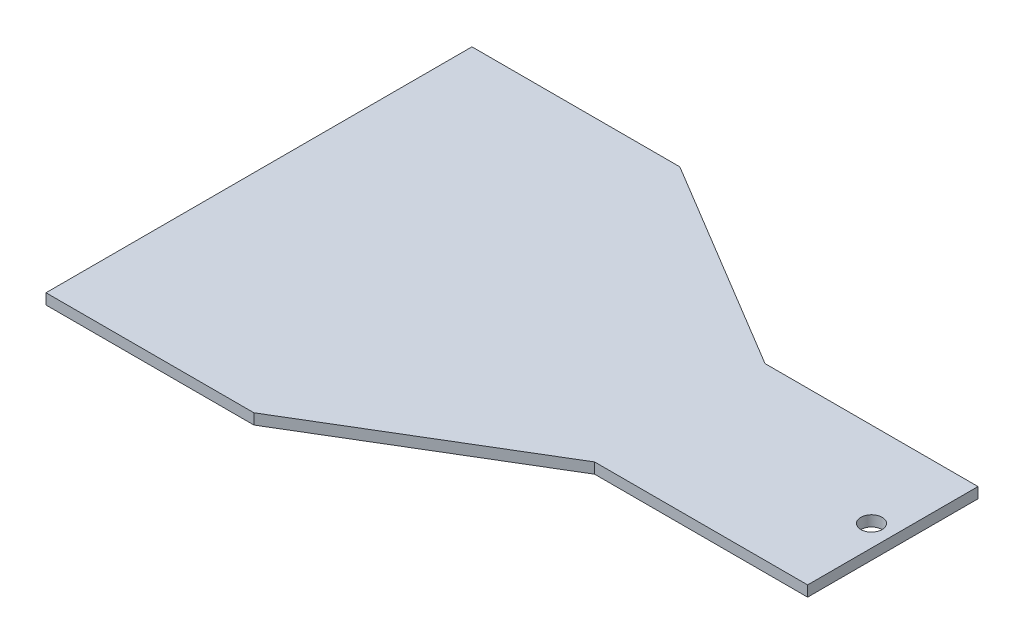
ISO-10303-21;
HEADER;
FILE_DESCRIPTION(('STEP AP214'),'2;1');
FILE_NAME('part.step','',(''),(''),'','','');
FILE_SCHEMA(('AUTOMOTIVE_DESIGN { 1 0 10303 214 1 1 1 1 }'));
ENDSEC;
DATA;
#1=APPLICATION_CONTEXT('core data for automotive mechanical design processes');
#2=APPLICATION_PROTOCOL_DEFINITION('international standard','automotive_design',2000,#1);
#3=PRODUCT_CONTEXT('',#1,'mechanical');
#4=PRODUCT('Part','Part','',(#3));
#5=PRODUCT_RELATED_PRODUCT_CATEGORY('part','',(#4));
#6=PRODUCT_DEFINITION_FORMATION('','',#4);
#7=PRODUCT_DEFINITION_CONTEXT('part definition',#1,'design');
#8=PRODUCT_DEFINITION('design','',#6,#7);
#9=PRODUCT_DEFINITION_SHAPE('','',#8);
#10=(LENGTH_UNIT() NAMED_UNIT(*) SI_UNIT(.MILLI.,.METRE.));
#11=(NAMED_UNIT(*) PLANE_ANGLE_UNIT() SI_UNIT($,.RADIAN.));
#12=(NAMED_UNIT(*) SI_UNIT($,.STERADIAN.) SOLID_ANGLE_UNIT());
#13=UNCERTAINTY_MEASURE_WITH_UNIT(LENGTH_MEASURE(1.E-05),#10,'distance_accuracy_value','');
#14=(GEOMETRIC_REPRESENTATION_CONTEXT(3) GLOBAL_UNCERTAINTY_ASSIGNED_CONTEXT((#13)) GLOBAL_UNIT_ASSIGNED_CONTEXT((#10,
#11,#12)) REPRESENTATION_CONTEXT('',''));
#15=CARTESIAN_POINT('',(0.,0.,0.));
#16=DIRECTION('',(0.,0.,1.));
#17=DIRECTION('',(1.,0.,0.));
#18=AXIS2_PLACEMENT_3D('',#15,#16,#17);
#19=CARTESIAN_POINT('',(0.,3.175,0.));
#20=DIRECTION('',(0.,-1.,0.));
#21=DIRECTION('',(0.,0.,-1.));
#22=AXIS2_PLACEMENT_3D('',#19,#20,#21);
#23=PLANE('',#22);
#24=DIRECTION('',(0.,0.,1.));
#25=VECTOR('',#24,1.);
#26=CARTESIAN_POINT('',(0.,3.175,0.));
#27=LINE('',#26,#25);
#28=CARTESIAN_POINT('',(0.,3.175,-127.));
#29=VERTEX_POINT('',#28);
#30=CARTESIAN_POINT('',(0.,3.175,0.));
#31=VERTEX_POINT('',#30);
#32=EDGE_CURVE('E144',#29,#31,#27,.T.);
#33=ORIENTED_EDGE('',*,*,#32,.T.);
#34=DIRECTION('',(1.,0.,0.));
#35=VECTOR('',#34,1.);
#36=CARTESIAN_POINT('',(0.,3.175,0.));
#37=LINE('',#36,#35);
#38=CARTESIAN_POINT('',(61.976,3.175,0.));
#39=VERTEX_POINT('',#38);
#40=EDGE_CURVE('E92',#31,#39,#37,.T.);
#41=ORIENTED_EDGE('',*,*,#40,.T.);
#42=DIRECTION('',(0.857492925712544,0.,-0.514495755427527));
#43=VECTOR('',#42,1.);
#44=CARTESIAN_POINT('',(61.976,3.175,0.));
#45=LINE('',#44,#43);
#46=CARTESIAN_POINT('',(125.476,3.175,-38.1));
#47=VERTEX_POINT('',#46);
#48=EDGE_CURVE('E159',#39,#47,#45,.T.);
#49=ORIENTED_EDGE('',*,*,#48,.T.);
#50=DIRECTION('',(1.,0.,0.));
#51=VECTOR('',#50,1.);
#52=CARTESIAN_POINT('',(125.476,3.175,-38.1));
#53=LINE('',#52,#51);
#54=CARTESIAN_POINT('',(188.976,3.175,-38.1));
#55=VERTEX_POINT('',#54);
#56=EDGE_CURVE('E172',#47,#55,#53,.T.);
#57=ORIENTED_EDGE('',*,*,#56,.T.);
#58=DIRECTION('',(0.,0.,-1.));
#59=VECTOR('',#58,1.);
#60=CARTESIAN_POINT('',(188.976,3.175,-38.1));
#61=LINE('',#60,#59);
#62=CARTESIAN_POINT('',(188.976,3.175,-88.9));
#63=VERTEX_POINT('',#62);
#64=EDGE_CURVE('E111',#55,#63,#61,.T.);
#65=ORIENTED_EDGE('',*,*,#64,.T.);
#66=DIRECTION('',(-1.,0.,0.));
#67=VECTOR('',#66,1.);
#68=CARTESIAN_POINT('',(125.476,3.175,-88.9));
#69=LINE('',#68,#67);
#70=CARTESIAN_POINT('',(125.476,3.175,-88.9));
#71=VERTEX_POINT('',#70);
#72=EDGE_CURVE('E105',#63,#71,#69,.T.);
#73=ORIENTED_EDGE('',*,*,#72,.T.);
#74=DIRECTION('',(-0.857492925712544,0.,-0.514495755427526));
#75=VECTOR('',#74,1.);
#76=CARTESIAN_POINT('',(125.476,3.175,-88.9));
#77=LINE('',#76,#75);
#78=CARTESIAN_POINT('',(61.976,3.175,-127.));
#79=VERTEX_POINT('',#78);
#80=EDGE_CURVE('E109',#71,#79,#77,.T.);
#81=ORIENTED_EDGE('',*,*,#80,.T.);
#82=DIRECTION('',(-1.,0.,0.));
#83=VECTOR('',#82,1.);
#84=CARTESIAN_POINT('',(0.,3.175,-127.));
#85=LINE('',#84,#83);
#86=EDGE_CURVE('E49',#79,#29,#85,.T.);
#87=ORIENTED_EDGE('',*,*,#86,.T.);
#88=EDGE_LOOP('',(#33,#41,#49,#57,#65,#73,#81,#87));
#89=FACE_BOUND('',#88,.T.);
#90=CARTESIAN_POINT('',(182.626,3.175,-63.5));
#91=DIRECTION('',(0.,1.,0.));
#92=DIRECTION('',(0.,0.,1.));
#93=AXIS2_PLACEMENT_3D('',#90,#91,#92);
#94=CIRCLE('',#93,3.175);
#95=CARTESIAN_POINT('',(182.626,3.175,-60.325));
#96=VERTEX_POINT('',#95);
#97=EDGE_CURVE('E133',#96,#96,#94,.T.);
#98=ORIENTED_EDGE('',*,*,#97,.F.);
#99=EDGE_LOOP('',(#98));
#100=FACE_BOUND('',#99,.T.);
#101=ADVANCED_FACE('F32',(#89,#100),#23,.F.);
#102=CARTESIAN_POINT('',(0.,0.,0.));
#103=DIRECTION('',(0.,-1.,0.));
#104=DIRECTION('',(0.,0.,-1.));
#105=AXIS2_PLACEMENT_3D('',#102,#103,#104);
#106=PLANE('',#105);
#107=DIRECTION('',(0.,0.,1.));
#108=VECTOR('',#107,1.);
#109=CARTESIAN_POINT('',(0.,0.,0.));
#110=LINE('',#109,#108);
#111=CARTESIAN_POINT('',(0.,0.,-127.));
#112=VERTEX_POINT('',#111);
#113=CARTESIAN_POINT('',(0.,0.,0.));
#114=VERTEX_POINT('',#113);
#115=EDGE_CURVE('E129',#112,#114,#110,.T.);
#116=ORIENTED_EDGE('',*,*,#115,.F.);
#117=DIRECTION('',(-1.,0.,0.));
#118=VECTOR('',#117,1.);
#119=CARTESIAN_POINT('',(0.,0.,-127.));
#120=LINE('',#119,#118);
#121=CARTESIAN_POINT('',(61.976,0.,-127.));
#122=VERTEX_POINT('',#121);
#123=EDGE_CURVE('E84',#122,#112,#120,.T.);
#124=ORIENTED_EDGE('',*,*,#123,.F.);
#125=DIRECTION('',(-0.857492925712544,0.,-0.514495755427526));
#126=VECTOR('',#125,1.);
#127=CARTESIAN_POINT('',(125.476,0.,-88.9));
#128=LINE('',#127,#126);
#129=CARTESIAN_POINT('',(125.476,0.,-88.9));
#130=VERTEX_POINT('',#129);
#131=EDGE_CURVE('E78',#130,#122,#128,.T.);
#132=ORIENTED_EDGE('',*,*,#131,.F.);
#133=DIRECTION('',(-1.,0.,0.));
#134=VECTOR('',#133,1.);
#135=CARTESIAN_POINT('',(125.476,0.,-88.9));
#136=LINE('',#135,#134);
#137=CARTESIAN_POINT('',(188.976,0.,-88.9));
#138=VERTEX_POINT('',#137);
#139=EDGE_CURVE('E119',#138,#130,#136,.T.);
#140=ORIENTED_EDGE('',*,*,#139,.F.);
#141=DIRECTION('',(0.,0.,-1.));
#142=VECTOR('',#141,1.);
#143=CARTESIAN_POINT('',(188.976,0.,-38.1));
#144=LINE('',#143,#142);
#145=CARTESIAN_POINT('',(188.976,0.,-38.1));
#146=VERTEX_POINT('',#145);
#147=EDGE_CURVE('E139',#146,#138,#144,.T.);
#148=ORIENTED_EDGE('',*,*,#147,.F.);
#149=DIRECTION('',(1.,0.,0.));
#150=VECTOR('',#149,1.);
#151=CARTESIAN_POINT('',(125.476,0.,-38.1));
#152=LINE('',#151,#150);
#153=CARTESIAN_POINT('',(125.476,0.,-38.1));
#154=VERTEX_POINT('',#153);
#155=EDGE_CURVE('E137',#154,#146,#152,.T.);
#156=ORIENTED_EDGE('',*,*,#155,.F.);
#157=DIRECTION('',(0.857492925712544,0.,-0.514495755427527));
#158=VECTOR('',#157,1.);
#159=CARTESIAN_POINT('',(61.976,0.,0.));
#160=LINE('',#159,#158);
#161=CARTESIAN_POINT('',(61.976,0.,0.));
#162=VERTEX_POINT('',#161);
#163=EDGE_CURVE('E135',#162,#154,#160,.T.);
#164=ORIENTED_EDGE('',*,*,#163,.F.);
#165=DIRECTION('',(1.,0.,0.));
#166=VECTOR('',#165,1.);
#167=CARTESIAN_POINT('',(0.,0.,0.));
#168=LINE('',#167,#166);
#169=EDGE_CURVE('E132',#114,#162,#168,.T.);
#170=ORIENTED_EDGE('',*,*,#169,.F.);
#171=EDGE_LOOP('',(#116,#124,#132,#140,#148,#156,#164,#170));
#172=FACE_BOUND('',#171,.T.);
#173=CARTESIAN_POINT('',(182.626,0.,-63.5));
#174=DIRECTION('',(0.,1.,0.));
#175=DIRECTION('',(0.,0.,1.));
#176=AXIS2_PLACEMENT_3D('',#173,#174,#175);
#177=CIRCLE('',#176,3.175);
#178=CARTESIAN_POINT('',(182.626,0.,-60.325));
#179=VERTEX_POINT('',#178);
#180=EDGE_CURVE('E178',#179,#179,#177,.T.);
#181=ORIENTED_EDGE('',*,*,#180,.T.);
#182=EDGE_LOOP('',(#181));
#183=FACE_BOUND('',#182,.T.);
#184=ADVANCED_FACE('F163',(#172,#183),#106,.T.);
#185=CARTESIAN_POINT('',(0.,3.175,0.));
#186=DIRECTION('',(1.,0.,0.));
#187=DIRECTION('',(0.,0.,-1.));
#188=AXIS2_PLACEMENT_3D('',#185,#186,#187);
#189=PLANE('',#188);
#190=ORIENTED_EDGE('',*,*,#115,.T.);
#191=DIRECTION('',(0.,-1.,0.));
#192=VECTOR('',#191,1.);
#193=CARTESIAN_POINT('',(0.,3.175,0.));
#194=LINE('',#193,#192);
#195=EDGE_CURVE('E11',#31,#114,#194,.T.);
#196=ORIENTED_EDGE('',*,*,#195,.F.);
#197=ORIENTED_EDGE('',*,*,#32,.F.);
#198=DIRECTION('',(0.,-1.,0.));
#199=VECTOR('',#198,1.);
#200=CARTESIAN_POINT('',(0.,3.175,-127.));
#201=LINE('',#200,#199);
#202=EDGE_CURVE('E125',#29,#112,#201,.T.);
#203=ORIENTED_EDGE('',*,*,#202,.T.);
#204=EDGE_LOOP('',(#190,#196,#197,#203));
#205=FACE_BOUND('',#204,.T.);
#206=ADVANCED_FACE('F34',(#205),#189,.F.);
#207=CARTESIAN_POINT('',(0.,3.175,0.));
#208=DIRECTION('',(0.,0.,-1.));
#209=DIRECTION('',(-1.,0.,0.));
#210=AXIS2_PLACEMENT_3D('',#207,#208,#209);
#211=PLANE('',#210);
#212=ORIENTED_EDGE('',*,*,#169,.T.);
#213=DIRECTION('',(0.,-1.,0.));
#214=VECTOR('',#213,1.);
#215=CARTESIAN_POINT('',(61.976,3.175,0.));
#216=LINE('',#215,#214);
#217=EDGE_CURVE('E41',#39,#162,#216,.T.);
#218=ORIENTED_EDGE('',*,*,#217,.F.);
#219=ORIENTED_EDGE('',*,*,#40,.F.);
#220=ORIENTED_EDGE('',*,*,#195,.T.);
#221=EDGE_LOOP('',(#212,#218,#219,#220));
#222=FACE_BOUND('',#221,.T.);
#223=ADVANCED_FACE('F206',(#222),#211,.F.);
#224=CARTESIAN_POINT('',(61.976,3.175,0.));
#225=DIRECTION('',(-0.514495755427527,0.,-0.857492925712544));
#226=DIRECTION('',(-0.857492925712544,0.,0.514495755427527));
#227=AXIS2_PLACEMENT_3D('',#224,#225,#226);
#228=PLANE('',#227);
#229=ORIENTED_EDGE('',*,*,#163,.T.);
#230=DIRECTION('',(0.,-1.,0.));
#231=VECTOR('',#230,1.);
#232=CARTESIAN_POINT('',(125.476,3.175,-38.1));
#233=LINE('',#232,#231);
#234=EDGE_CURVE('E151',#47,#154,#233,.T.);
#235=ORIENTED_EDGE('',*,*,#234,.F.);
#236=ORIENTED_EDGE('',*,*,#48,.F.);
#237=ORIENTED_EDGE('',*,*,#217,.T.);
#238=EDGE_LOOP('',(#229,#235,#236,#237));
#239=FACE_BOUND('',#238,.T.);
#240=ADVANCED_FACE('F157',(#239),#228,.F.);
#241=CARTESIAN_POINT('',(125.476,3.175,-38.1));
#242=DIRECTION('',(0.,0.,-1.));
#243=DIRECTION('',(-1.,0.,0.));
#244=AXIS2_PLACEMENT_3D('',#241,#242,#243);
#245=PLANE('',#244);
#246=ORIENTED_EDGE('',*,*,#155,.T.);
#247=DIRECTION('',(0.,-1.,0.));
#248=VECTOR('',#247,1.);
#249=CARTESIAN_POINT('',(188.976,3.175,-38.1));
#250=LINE('',#249,#248);
#251=EDGE_CURVE('E148',#55,#146,#250,.T.);
#252=ORIENTED_EDGE('',*,*,#251,.F.);
#253=ORIENTED_EDGE('',*,*,#56,.F.);
#254=ORIENTED_EDGE('',*,*,#234,.T.);
#255=EDGE_LOOP('',(#246,#252,#253,#254));
#256=FACE_BOUND('',#255,.T.);
#257=ADVANCED_FACE('F168',(#256),#245,.F.);
#258=CARTESIAN_POINT('',(188.976,3.175,-38.1));
#259=DIRECTION('',(-1.,0.,0.));
#260=DIRECTION('',(0.,0.,1.));
#261=AXIS2_PLACEMENT_3D('',#258,#259,#260);
#262=PLANE('',#261);
#263=ORIENTED_EDGE('',*,*,#147,.T.);
#264=DIRECTION('',(0.,-1.,0.));
#265=VECTOR('',#264,1.);
#266=CARTESIAN_POINT('',(188.976,3.175,-88.9));
#267=LINE('',#266,#265);
#268=EDGE_CURVE('E120',#63,#138,#267,.T.);
#269=ORIENTED_EDGE('',*,*,#268,.F.);
#270=ORIENTED_EDGE('',*,*,#64,.F.);
#271=ORIENTED_EDGE('',*,*,#251,.T.);
#272=EDGE_LOOP('',(#263,#269,#270,#271));
#273=FACE_BOUND('',#272,.T.);
#274=ADVANCED_FACE('F171',(#273),#262,.F.);
#275=CARTESIAN_POINT('',(125.476,3.175,-88.9));
#276=DIRECTION('',(0.,0.,1.));
#277=DIRECTION('',(1.,0.,0.));
#278=AXIS2_PLACEMENT_3D('',#275,#276,#277);
#279=PLANE('',#278);
#280=ORIENTED_EDGE('',*,*,#139,.T.);
#281=DIRECTION('',(0.,-1.,0.));
#282=VECTOR('',#281,1.);
#283=CARTESIAN_POINT('',(125.476,3.175,-88.9));
#284=LINE('',#283,#282);
#285=EDGE_CURVE('E116',#71,#130,#284,.T.);
#286=ORIENTED_EDGE('',*,*,#285,.F.);
#287=ORIENTED_EDGE('',*,*,#72,.F.);
#288=ORIENTED_EDGE('',*,*,#268,.T.);
#289=EDGE_LOOP('',(#280,#286,#287,#288));
#290=FACE_BOUND('',#289,.T.);
#291=ADVANCED_FACE('F117',(#290),#279,.F.);
#292=CARTESIAN_POINT('',(125.476,3.175,-88.9));
#293=DIRECTION('',(-0.514495755427526,0.,0.857492925712544));
#294=DIRECTION('',(0.857492925712544,0.,0.514495755427526));
#295=AXIS2_PLACEMENT_3D('',#292,#293,#294);
#296=PLANE('',#295);
#297=ORIENTED_EDGE('',*,*,#131,.T.);
#298=DIRECTION('',(0.,-1.,0.));
#299=VECTOR('',#298,1.);
#300=CARTESIAN_POINT('',(61.976,3.175,-127.));
#301=LINE('',#300,#299);
#302=EDGE_CURVE('E121',#79,#122,#301,.T.);
#303=ORIENTED_EDGE('',*,*,#302,.F.);
#304=ORIENTED_EDGE('',*,*,#80,.F.);
#305=ORIENTED_EDGE('',*,*,#285,.T.);
#306=EDGE_LOOP('',(#297,#303,#304,#305));
#307=FACE_BOUND('',#306,.T.);
#308=ADVANCED_FACE('F123',(#307),#296,.F.);
#309=CARTESIAN_POINT('',(0.,3.175,-127.));
#310=DIRECTION('',(0.,0.,1.));
#311=DIRECTION('',(1.,0.,0.));
#312=AXIS2_PLACEMENT_3D('',#309,#310,#311);
#313=PLANE('',#312);
#314=ORIENTED_EDGE('',*,*,#123,.T.);
#315=ORIENTED_EDGE('',*,*,#202,.F.);
#316=ORIENTED_EDGE('',*,*,#86,.F.);
#317=ORIENTED_EDGE('',*,*,#302,.T.);
#318=EDGE_LOOP('',(#314,#315,#316,#317));
#319=FACE_BOUND('',#318,.T.);
#320=ADVANCED_FACE('F194',(#319),#313,.F.);
#321=CARTESIAN_POINT('',(182.626,3.175,-63.5));
#322=DIRECTION('',(0.,-1.,0.));
#323=DIRECTION('',(0.,0.,-1.));
#324=AXIS2_PLACEMENT_3D('',#321,#322,#323);
#325=CYLINDRICAL_SURFACE('',#324,3.175);
#326=ORIENTED_EDGE('',*,*,#97,.T.);
#327=EDGE_LOOP('',(#326));
#328=FACE_BOUND('',#327,.T.);
#329=ORIENTED_EDGE('',*,*,#180,.F.);
#330=EDGE_LOOP('',(#329));
#331=FACE_BOUND('',#330,.T.);
#332=ADVANCED_FACE('F184',(#328,#331),#325,.F.);
#333=CLOSED_SHELL('',(#101,#184,#206,#223,#240,#257,#274,#291,#308,#320,#332));
#334=MANIFOLD_SOLID_BREP('B2',#333);
#335=ADVANCED_BREP_SHAPE_REPRESENTATION('',(#18,#334),#14);
#336=SHAPE_DEFINITION_REPRESENTATION(#9,#335);
ENDSEC;
END-ISO-10303-21;
